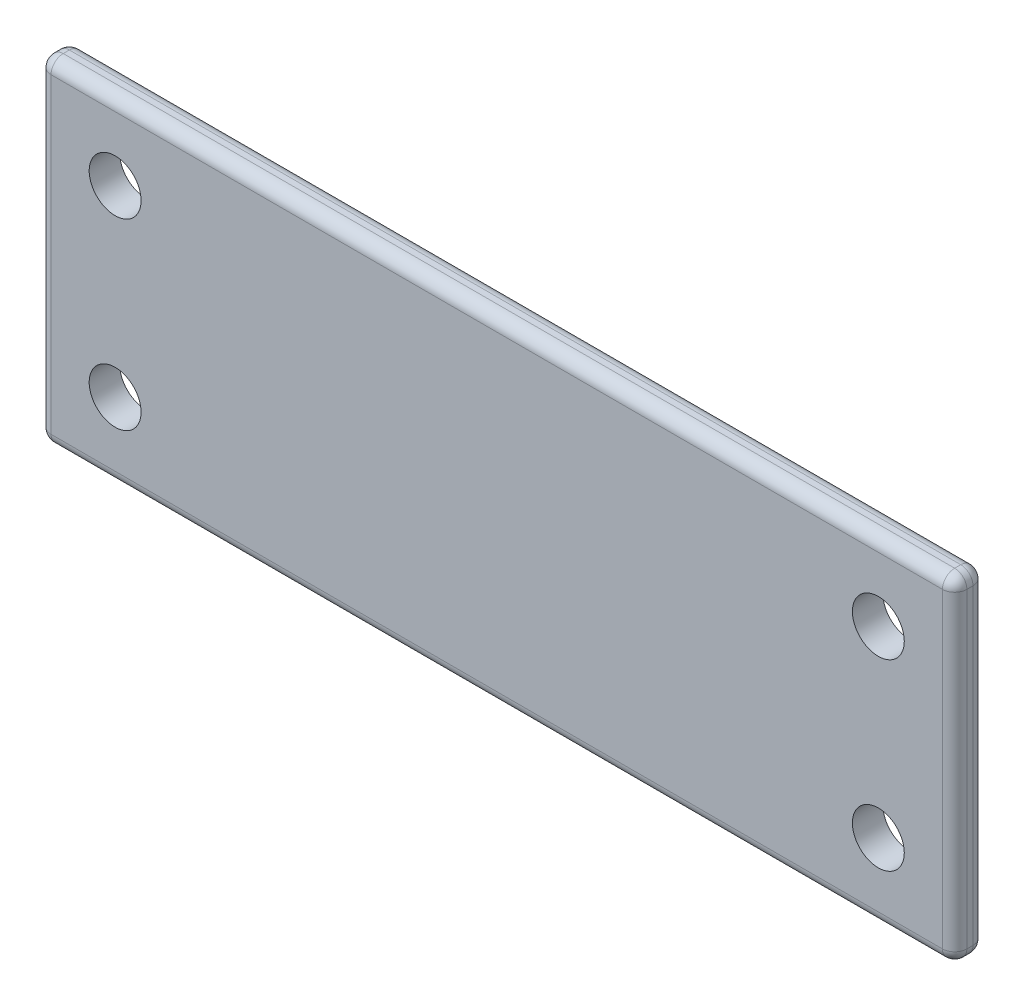
ISO-10303-21;
HEADER;
FILE_DESCRIPTION(('STEP AP214'),'2;1');
FILE_NAME('part.step','',(''),(''),'','','');
FILE_SCHEMA(('AUTOMOTIVE_DESIGN { 1 0 10303 214 1 1 1 1 }'));
ENDSEC;
DATA;
#1=APPLICATION_CONTEXT('core data for automotive mechanical design processes');
#2=APPLICATION_PROTOCOL_DEFINITION('international standard','automotive_design',2000,#1);
#3=PRODUCT_CONTEXT('',#1,'mechanical');
#4=PRODUCT('Part','Part','',(#3));
#5=PRODUCT_RELATED_PRODUCT_CATEGORY('part','',(#4));
#6=PRODUCT_DEFINITION_FORMATION('','',#4);
#7=PRODUCT_DEFINITION_CONTEXT('part definition',#1,'design');
#8=PRODUCT_DEFINITION('design','',#6,#7);
#9=PRODUCT_DEFINITION_SHAPE('','',#8);
#10=(LENGTH_UNIT() NAMED_UNIT(*) SI_UNIT(.MILLI.,.METRE.));
#11=(NAMED_UNIT(*) PLANE_ANGLE_UNIT() SI_UNIT($,.RADIAN.));
#12=(NAMED_UNIT(*) SI_UNIT($,.STERADIAN.) SOLID_ANGLE_UNIT());
#13=UNCERTAINTY_MEASURE_WITH_UNIT(LENGTH_MEASURE(1.E-05),#10,'distance_accuracy_value','');
#14=(GEOMETRIC_REPRESENTATION_CONTEXT(3) GLOBAL_UNCERTAINTY_ASSIGNED_CONTEXT((#13)) GLOBAL_UNIT_ASSIGNED_CONTEXT((#10,
#11,#12)) REPRESENTATION_CONTEXT('',''));
#15=CARTESIAN_POINT('',(0.,0.,0.));
#16=DIRECTION('',(0.,0.,1.));
#17=DIRECTION('',(1.,0.,0.));
#18=AXIS2_PLACEMENT_3D('',#15,#16,#17);
#19=CARTESIAN_POINT('',(29.2,19.2,8.781854409));
#20=DIRECTION('',(0.,-1.,0.));
#21=DIRECTION('',(1.,0.,0.));
#22=AXIS2_PLACEMENT_3D('',#19,#20,#21);
#23=SPHERICAL_SURFACE('',#22,0.8);
#24=CARTESIAN_POINT('',(29.2,19.2,8.781854409));
#25=DIRECTION('',(0.,0.,-1.));
#26=DIRECTION('',(1.,0.,0.));
#27=AXIS2_PLACEMENT_3D('',#24,#25,#26);
#28=CIRCLE('',#27,0.8);
#29=CARTESIAN_POINT('',(29.2,20.,8.781854409));
#30=VERTEX_POINT('',#29);
#31=CARTESIAN_POINT('',(30.,19.2,8.781854409));
#32=VERTEX_POINT('',#31);
#33=EDGE_CURVE('E10',#30,#32,#28,.T.);
#34=ORIENTED_EDGE('',*,*,#33,.F.);
#35=CARTESIAN_POINT('',(29.2,19.2,8.781854409));
#36=DIRECTION('',(1.,0.,0.));
#37=DIRECTION('',(0.,0.,1.));
#38=AXIS2_PLACEMENT_3D('',#35,#36,#37);
#39=CIRCLE('',#38,0.8);
#40=CARTESIAN_POINT('',(29.2,19.2,9.581854409));
#41=VERTEX_POINT('',#40);
#42=EDGE_CURVE('E318',#30,#41,#39,.T.);
#43=ORIENTED_EDGE('',*,*,#42,.T.);
#44=CARTESIAN_POINT('',(29.2,19.2,8.781854409));
#45=DIRECTION('',(0.,-1.,0.));
#46=DIRECTION('',(1.,0.,0.));
#47=AXIS2_PLACEMENT_3D('',#44,#45,#46);
#48=CIRCLE('',#47,0.8);
#49=EDGE_CURVE('E323',#32,#41,#48,.T.);
#50=ORIENTED_EDGE('',*,*,#49,.F.);
#51=EDGE_LOOP('',(#34,#43,#50));
#52=FACE_BOUND('',#51,.T.);
#53=ADVANCED_FACE('F16',(#52),#23,.T.);
#54=CARTESIAN_POINT('',(29.2,19.2,8.381854409));
#55=DIRECTION('',(0.,0.,1.));
#56=DIRECTION('',(1.,0.,0.));
#57=AXIS2_PLACEMENT_3D('',#54,#55,#56);
#58=SPHERICAL_SURFACE('',#57,0.8);
#59=CARTESIAN_POINT('',(29.2,19.2,8.381854409));
#60=DIRECTION('',(0.,-1.,0.));
#61=DIRECTION('',(1.,0.,0.));
#62=AXIS2_PLACEMENT_3D('',#59,#60,#61);
#63=CIRCLE('',#62,0.8);
#64=CARTESIAN_POINT('',(29.2,19.2,7.581854409));
#65=VERTEX_POINT('',#64);
#66=CARTESIAN_POINT('',(30.,19.2,8.381854409));
#67=VERTEX_POINT('',#66);
#68=EDGE_CURVE('E310',#65,#67,#63,.T.);
#69=ORIENTED_EDGE('',*,*,#68,.F.);
#70=CARTESIAN_POINT('',(29.2,19.2,8.381854409));
#71=DIRECTION('',(1.,0.,0.));
#72=DIRECTION('',(0.,1.,0.));
#73=AXIS2_PLACEMENT_3D('',#70,#71,#72);
#74=CIRCLE('',#73,0.8);
#75=CARTESIAN_POINT('',(29.2,20.,8.381854409));
#76=VERTEX_POINT('',#75);
#77=EDGE_CURVE('E303',#65,#76,#74,.T.);
#78=ORIENTED_EDGE('',*,*,#77,.T.);
#79=CARTESIAN_POINT('',(29.2,19.2,8.381854409));
#80=DIRECTION('',(0.,0.,1.));
#81=DIRECTION('',(1.,0.,0.));
#82=AXIS2_PLACEMENT_3D('',#79,#80,#81);
#83=CIRCLE('',#82,0.8);
#84=EDGE_CURVE('E19',#67,#76,#83,.T.);
#85=ORIENTED_EDGE('',*,*,#84,.F.);
#86=EDGE_LOOP('',(#69,#78,#85));
#87=FACE_BOUND('',#86,.T.);
#88=ADVANCED_FACE('F341',(#87),#58,.T.);
#89=CARTESIAN_POINT('',(30.,-2.,7.581854409));
#90=DIRECTION('',(1.,0.,0.));
#91=DIRECTION('',(0.,1.,0.));
#92=AXIS2_PLACEMENT_3D('',#89,#90,#91);
#93=PLANE('',#92);
#94=DIRECTION('',(0.,0.,1.));
#95=VECTOR('',#94,1.);
#96=CARTESIAN_POINT('',(30.,-1.2,7.581854409));
#97=LINE('',#96,#95);
#98=CARTESIAN_POINT('',(30.,-1.2,8.381854409));
#99=VERTEX_POINT('',#98);
#100=CARTESIAN_POINT('',(30.,-1.2,8.781854409));
#101=VERTEX_POINT('',#100);
#102=EDGE_CURVE('E299',#99,#101,#97,.T.);
#103=ORIENTED_EDGE('',*,*,#102,.F.);
#104=DIRECTION('',(0.,1.,0.));
#105=VECTOR('',#104,1.);
#106=CARTESIAN_POINT('',(30.,-2.,8.381854409));
#107=LINE('',#106,#105);
#108=EDGE_CURVE('E314',#99,#67,#107,.T.);
#109=ORIENTED_EDGE('',*,*,#108,.T.);
#110=DIRECTION('',(0.,0.,1.));
#111=VECTOR('',#110,1.);
#112=CARTESIAN_POINT('',(30.,19.2,7.581854409));
#113=LINE('',#112,#111);
#114=EDGE_CURVE('E328',#67,#32,#113,.T.);
#115=ORIENTED_EDGE('',*,*,#114,.T.);
#116=DIRECTION('',(0.,1.,0.));
#117=VECTOR('',#116,1.);
#118=CARTESIAN_POINT('',(30.,-2.,8.781854409));
#119=LINE('',#118,#117);
#120=EDGE_CURVE('E319',#101,#32,#119,.T.);
#121=ORIENTED_EDGE('',*,*,#120,.F.);
#122=EDGE_LOOP('',(#103,#109,#115,#121));
#123=FACE_BOUND('',#122,.T.);
#124=ADVANCED_FACE('F424',(#123),#93,.T.);
#125=CARTESIAN_POINT('',(29.2,-1.2,8.781854409));
#126=DIRECTION('',(0.,0.,-1.));
#127=DIRECTION('',(1.,0.,0.));
#128=AXIS2_PLACEMENT_3D('',#125,#126,#127);
#129=SPHERICAL_SURFACE('',#128,0.8);
#130=CARTESIAN_POINT('',(29.2,-1.2,8.781854409));
#131=DIRECTION('',(0.,1.,0.));
#132=DIRECTION('',(1.,0.,0.));
#133=AXIS2_PLACEMENT_3D('',#130,#131,#132);
#134=CIRCLE('',#133,0.8);
#135=CARTESIAN_POINT('',(29.2,-1.2,9.581854409));
#136=VERTEX_POINT('',#135);
#137=EDGE_CURVE('E326',#136,#101,#134,.T.);
#138=ORIENTED_EDGE('',*,*,#137,.F.);
#139=CARTESIAN_POINT('',(29.2,-1.2,8.781854409));
#140=DIRECTION('',(1.,0.,0.));
#141=DIRECTION('',(0.,-1.,0.));
#142=AXIS2_PLACEMENT_3D('',#139,#140,#141);
#143=CIRCLE('',#142,0.8);
#144=CARTESIAN_POINT('',(29.2,-2.,8.781854409));
#145=VERTEX_POINT('',#144);
#146=EDGE_CURVE('E291',#136,#145,#143,.T.);
#147=ORIENTED_EDGE('',*,*,#146,.T.);
#148=CARTESIAN_POINT('',(29.2,-1.2,8.781854409));
#149=DIRECTION('',(0.,0.,-1.));
#150=DIRECTION('',(1.,0.,0.));
#151=AXIS2_PLACEMENT_3D('',#148,#149,#150);
#152=CIRCLE('',#151,0.8);
#153=EDGE_CURVE('E295',#101,#145,#152,.T.);
#154=ORIENTED_EDGE('',*,*,#153,.F.);
#155=EDGE_LOOP('',(#138,#147,#154));
#156=FACE_BOUND('',#155,.T.);
#157=ADVANCED_FACE('F429',(#156),#129,.T.);
#158=CARTESIAN_POINT('',(29.2,-1.2,8.381854409));
#159=DIRECTION('',(0.,0.,1.));
#160=DIRECTION('',(1.,0.,0.));
#161=AXIS2_PLACEMENT_3D('',#158,#159,#160);
#162=SPHERICAL_SURFACE('',#161,0.8);
#163=CARTESIAN_POINT('',(29.2,-1.2,8.381854409));
#164=DIRECTION('',(0.,0.,-1.));
#165=DIRECTION('',(1.,0.,0.));
#166=AXIS2_PLACEMENT_3D('',#163,#164,#165);
#167=CIRCLE('',#166,0.8);
#168=CARTESIAN_POINT('',(29.2,-2.,8.381854409));
#169=VERTEX_POINT('',#168);
#170=EDGE_CURVE('E296',#99,#169,#167,.T.);
#171=ORIENTED_EDGE('',*,*,#170,.T.);
#172=CARTESIAN_POINT('',(29.2,-1.2,8.381854409));
#173=DIRECTION('',(-1.,0.,0.));
#174=DIRECTION('',(0.,-1.,0.));
#175=AXIS2_PLACEMENT_3D('',#172,#173,#174);
#176=CIRCLE('',#175,0.8);
#177=CARTESIAN_POINT('',(29.2,-1.2,7.581854409));
#178=VERTEX_POINT('',#177);
#179=EDGE_CURVE('E193',#178,#169,#176,.T.);
#180=ORIENTED_EDGE('',*,*,#179,.F.);
#181=CARTESIAN_POINT('',(29.2,-1.2,8.381854409));
#182=DIRECTION('',(0.,-1.,0.));
#183=DIRECTION('',(1.,0.,0.));
#184=AXIS2_PLACEMENT_3D('',#181,#182,#183);
#185=CIRCLE('',#184,0.8);
#186=EDGE_CURVE('E306',#178,#99,#185,.T.);
#187=ORIENTED_EDGE('',*,*,#186,.T.);
#188=EDGE_LOOP('',(#171,#180,#187));
#189=FACE_BOUND('',#188,.T.);
#190=ADVANCED_FACE('F449',(#189),#162,.T.);
#191=CARTESIAN_POINT('',(29.2,19.2,7.581854409));
#192=DIRECTION('',(0.,0.,1.));
#193=DIRECTION('',(1.,0.,0.));
#194=AXIS2_PLACEMENT_3D('',#191,#192,#193);
#195=CYLINDRICAL_SURFACE('',#194,0.8);
#196=ORIENTED_EDGE('',*,*,#114,.F.);
#197=ORIENTED_EDGE('',*,*,#84,.T.);
#198=DIRECTION('',(0.,0.,1.));
#199=VECTOR('',#198,1.);
#200=CARTESIAN_POINT('',(29.2,20.,7.581854409));
#201=LINE('',#200,#199);
#202=EDGE_CURVE('E194',#76,#30,#201,.T.);
#203=ORIENTED_EDGE('',*,*,#202,.T.);
#204=ORIENTED_EDGE('',*,*,#33,.T.);
#205=EDGE_LOOP('',(#196,#197,#203,#204));
#206=FACE_BOUND('',#205,.T.);
#207=ADVANCED_FACE('F338',(#206),#195,.T.);
#208=CARTESIAN_POINT('',(29.2,-2.,8.781854409));
#209=DIRECTION('',(0.,1.,0.));
#210=DIRECTION('',(1.,0.,0.));
#211=AXIS2_PLACEMENT_3D('',#208,#209,#210);
#212=CYLINDRICAL_SURFACE('',#211,0.8);
#213=ORIENTED_EDGE('',*,*,#120,.T.);
#214=ORIENTED_EDGE('',*,*,#49,.T.);
#215=DIRECTION('',(0.,1.,0.));
#216=VECTOR('',#215,1.);
#217=CARTESIAN_POINT('',(29.2,-2.,9.581854409));
#218=LINE('',#217,#216);
#219=EDGE_CURVE('E259',#136,#41,#218,.T.);
#220=ORIENTED_EDGE('',*,*,#219,.F.);
#221=ORIENTED_EDGE('',*,*,#137,.T.);
#222=EDGE_LOOP('',(#213,#214,#220,#221));
#223=FACE_BOUND('',#222,.T.);
#224=ADVANCED_FACE('F371',(#223),#212,.T.);
#225=CARTESIAN_POINT('',(-30.,19.2,8.781854409));
#226=DIRECTION('',(1.,0.,0.));
#227=DIRECTION('',(0.,1.,0.));
#228=AXIS2_PLACEMENT_3D('',#225,#226,#227);
#229=CYLINDRICAL_SURFACE('',#228,0.8);
#230=CARTESIAN_POINT('',(-29.2,19.2,8.781854409));
#231=DIRECTION('',(1.,0.,0.));
#232=DIRECTION('',(0.,0.,1.));
#233=AXIS2_PLACEMENT_3D('',#230,#231,#232);
#234=CIRCLE('',#233,0.8);
#235=CARTESIAN_POINT('',(-29.2,20.,8.781854409));
#236=VERTEX_POINT('',#235);
#237=CARTESIAN_POINT('',(-29.2,19.2,9.581854409));
#238=VERTEX_POINT('',#237);
#239=EDGE_CURVE('E283',#236,#238,#234,.T.);
#240=ORIENTED_EDGE('',*,*,#239,.T.);
#241=DIRECTION('',(1.,0.,0.));
#242=VECTOR('',#241,1.);
#243=CARTESIAN_POINT('',(-30.,19.2,9.581854409));
#244=LINE('',#243,#242);
#245=EDGE_CURVE('E263',#238,#41,#244,.T.);
#246=ORIENTED_EDGE('',*,*,#245,.T.);
#247=ORIENTED_EDGE('',*,*,#42,.F.);
#248=DIRECTION('',(1.,0.,0.));
#249=VECTOR('',#248,1.);
#250=CARTESIAN_POINT('',(-30.,20.,8.781854409));
#251=LINE('',#250,#249);
#252=EDGE_CURVE('E220',#236,#30,#251,.T.);
#253=ORIENTED_EDGE('',*,*,#252,.F.);
#254=EDGE_LOOP('',(#240,#246,#247,#253));
#255=FACE_BOUND('',#254,.T.);
#256=ADVANCED_FACE('F352',(#255),#229,.T.);
#257=CARTESIAN_POINT('',(25.,15.,6.081854409));
#258=DIRECTION('',(0.,0.,1.));
#259=DIRECTION('',(1.,0.,0.));
#260=AXIS2_PLACEMENT_3D('',#257,#258,#259);
#261=CYLINDRICAL_SURFACE('',#260,1.7);
#262=CARTESIAN_POINT('',(25.,15.,9.581854409));
#263=DIRECTION('',(0.,0.,1.));
#264=DIRECTION('',(1.,0.,0.));
#265=AXIS2_PLACEMENT_3D('',#262,#263,#264);
#266=CIRCLE('',#265,1.7);
#267=CARTESIAN_POINT('',(26.7,15.,9.581854409));
#268=VERTEX_POINT('',#267);
#269=EDGE_CURVE('E279',#268,#268,#266,.T.);
#270=ORIENTED_EDGE('',*,*,#269,.T.);
#271=EDGE_LOOP('',(#270));
#272=FACE_BOUND('',#271,.T.);
#273=CARTESIAN_POINT('',(25.,15.,7.581854409));
#274=DIRECTION('',(0.,0.,1.));
#275=DIRECTION('',(1.,0.,0.));
#276=AXIS2_PLACEMENT_3D('',#273,#274,#275);
#277=CIRCLE('',#276,1.7);
#278=CARTESIAN_POINT('',(26.7,15.,7.581854409));
#279=VERTEX_POINT('',#278);
#280=EDGE_CURVE('E247',#279,#279,#277,.T.);
#281=ORIENTED_EDGE('',*,*,#280,.F.);
#282=EDGE_LOOP('',(#281));
#283=FACE_BOUND('',#282,.T.);
#284=ADVANCED_FACE('F439',(#272,#283),#261,.F.);
#285=CARTESIAN_POINT('',(-25.,15.,6.081854409));
#286=DIRECTION('',(0.,0.,1.));
#287=DIRECTION('',(1.,0.,0.));
#288=AXIS2_PLACEMENT_3D('',#285,#286,#287);
#289=CYLINDRICAL_SURFACE('',#288,1.7);
#290=CARTESIAN_POINT('',(-25.,15.,9.581854409));
#291=DIRECTION('',(0.,0.,1.));
#292=DIRECTION('',(1.,0.,0.));
#293=AXIS2_PLACEMENT_3D('',#290,#291,#292);
#294=CIRCLE('',#293,1.7);
#295=CARTESIAN_POINT('',(-23.3,15.,9.581854409));
#296=VERTEX_POINT('',#295);
#297=EDGE_CURVE('E274',#296,#296,#294,.T.);
#298=ORIENTED_EDGE('',*,*,#297,.T.);
#299=EDGE_LOOP('',(#298));
#300=FACE_BOUND('',#299,.T.);
#301=CARTESIAN_POINT('',(-25.,15.,7.581854409));
#302=DIRECTION('',(0.,0.,1.));
#303=DIRECTION('',(1.,0.,0.));
#304=AXIS2_PLACEMENT_3D('',#301,#302,#303);
#305=CIRCLE('',#304,1.7);
#306=CARTESIAN_POINT('',(-23.3,15.,7.581854409));
#307=VERTEX_POINT('',#306);
#308=EDGE_CURVE('E243',#307,#307,#305,.T.);
#309=ORIENTED_EDGE('',*,*,#308,.F.);
#310=EDGE_LOOP('',(#309));
#311=FACE_BOUND('',#310,.T.);
#312=ADVANCED_FACE('F437',(#300,#311),#289,.F.);
#313=CARTESIAN_POINT('',(25.,3.,6.081854409));
#314=DIRECTION('',(0.,0.,1.));
#315=DIRECTION('',(1.,0.,0.));
#316=AXIS2_PLACEMENT_3D('',#313,#314,#315);
#317=CYLINDRICAL_SURFACE('',#316,1.7);
#318=CARTESIAN_POINT('',(25.,3.,9.581854409));
#319=DIRECTION('',(0.,0.,1.));
#320=DIRECTION('',(1.,0.,0.));
#321=AXIS2_PLACEMENT_3D('',#318,#319,#320);
#322=CIRCLE('',#321,1.7);
#323=CARTESIAN_POINT('',(26.7,3.,9.581854409));
#324=VERTEX_POINT('',#323);
#325=EDGE_CURVE('E271',#324,#324,#322,.T.);
#326=ORIENTED_EDGE('',*,*,#325,.T.);
#327=EDGE_LOOP('',(#326));
#328=FACE_BOUND('',#327,.T.);
#329=CARTESIAN_POINT('',(25.,3.,7.581854409));
#330=DIRECTION('',(0.,0.,1.));
#331=DIRECTION('',(1.,0.,0.));
#332=AXIS2_PLACEMENT_3D('',#329,#330,#331);
#333=CIRCLE('',#332,1.7);
#334=CARTESIAN_POINT('',(26.7,3.,7.581854409));
#335=VERTEX_POINT('',#334);
#336=EDGE_CURVE('E239',#335,#335,#333,.T.);
#337=ORIENTED_EDGE('',*,*,#336,.F.);
#338=EDGE_LOOP('',(#337));
#339=FACE_BOUND('',#338,.T.);
#340=ADVANCED_FACE('F434',(#328,#339),#317,.F.);
#341=CARTESIAN_POINT('',(-25.,3.,6.081854409));
#342=DIRECTION('',(0.,0.,1.));
#343=DIRECTION('',(1.,0.,0.));
#344=AXIS2_PLACEMENT_3D('',#341,#342,#343);
#345=CYLINDRICAL_SURFACE('',#344,1.7);
#346=CARTESIAN_POINT('',(-25.,3.,9.581854409));
#347=DIRECTION('',(0.,0.,1.));
#348=DIRECTION('',(1.,0.,0.));
#349=AXIS2_PLACEMENT_3D('',#346,#347,#348);
#350=CIRCLE('',#349,1.7);
#351=CARTESIAN_POINT('',(-23.3,3.,9.581854409));
#352=VERTEX_POINT('',#351);
#353=EDGE_CURVE('E267',#352,#352,#350,.T.);
#354=ORIENTED_EDGE('',*,*,#353,.T.);
#355=EDGE_LOOP('',(#354));
#356=FACE_BOUND('',#355,.T.);
#357=CARTESIAN_POINT('',(-25.,3.,7.581854409));
#358=DIRECTION('',(0.,0.,1.));
#359=DIRECTION('',(1.,0.,0.));
#360=AXIS2_PLACEMENT_3D('',#357,#358,#359);
#361=CIRCLE('',#360,1.7);
#362=CARTESIAN_POINT('',(-23.3,3.,7.581854409));
#363=VERTEX_POINT('',#362);
#364=EDGE_CURVE('E146',#363,#363,#361,.T.);
#365=ORIENTED_EDGE('',*,*,#364,.F.);
#366=EDGE_LOOP('',(#365));
#367=FACE_BOUND('',#366,.T.);
#368=ADVANCED_FACE('F432',(#356,#367),#345,.F.);
#369=CARTESIAN_POINT('',(29.2,-2.,8.381854409));
#370=DIRECTION('',(0.,1.,0.));
#371=DIRECTION('',(1.,0.,0.));
#372=AXIS2_PLACEMENT_3D('',#369,#370,#371);
#373=CYLINDRICAL_SURFACE('',#372,0.8);
#374=ORIENTED_EDGE('',*,*,#186,.F.);
#375=DIRECTION('',(0.,1.,0.));
#376=VECTOR('',#375,1.);
#377=CARTESIAN_POINT('',(29.2,-2.,7.581854409));
#378=LINE('',#377,#376);
#379=EDGE_CURVE('E142',#178,#65,#378,.T.);
#380=ORIENTED_EDGE('',*,*,#379,.T.);
#381=ORIENTED_EDGE('',*,*,#68,.T.);
#382=ORIENTED_EDGE('',*,*,#108,.F.);
#383=EDGE_LOOP('',(#374,#380,#381,#382));
#384=FACE_BOUND('',#383,.T.);
#385=ADVANCED_FACE('F469',(#384),#373,.T.);
#386=CARTESIAN_POINT('',(-30.,19.2,8.381854409));
#387=DIRECTION('',(1.,0.,0.));
#388=DIRECTION('',(0.,1.,0.));
#389=AXIS2_PLACEMENT_3D('',#386,#387,#388);
#390=CYLINDRICAL_SURFACE('',#389,0.8);
#391=DIRECTION('',(1.,0.,0.));
#392=VECTOR('',#391,1.);
#393=CARTESIAN_POINT('',(-30.,20.,8.381854409));
#394=LINE('',#393,#392);
#395=CARTESIAN_POINT('',(-29.2,20.,8.381854409));
#396=VERTEX_POINT('',#395);
#397=EDGE_CURVE('E189',#396,#76,#394,.T.);
#398=ORIENTED_EDGE('',*,*,#397,.T.);
#399=ORIENTED_EDGE('',*,*,#77,.F.);
#400=DIRECTION('',(1.,0.,0.));
#401=VECTOR('',#400,1.);
#402=CARTESIAN_POINT('',(-30.,19.2,7.581854409));
#403=LINE('',#402,#401);
#404=CARTESIAN_POINT('',(-29.2,19.2,7.581854409));
#405=VERTEX_POINT('',#404);
#406=EDGE_CURVE('E231',#405,#65,#403,.T.);
#407=ORIENTED_EDGE('',*,*,#406,.F.);
#408=CARTESIAN_POINT('',(-29.2,19.2,8.381854409));
#409=DIRECTION('',(1.,0.,0.));
#410=DIRECTION('',(0.,1.,0.));
#411=AXIS2_PLACEMENT_3D('',#408,#409,#410);
#412=CIRCLE('',#411,0.8);
#413=EDGE_CURVE('E251',#405,#396,#412,.T.);
#414=ORIENTED_EDGE('',*,*,#413,.T.);
#415=EDGE_LOOP('',(#398,#399,#407,#414));
#416=FACE_BOUND('',#415,.T.);
#417=ADVANCED_FACE('F344',(#416),#390,.T.);
#418=CARTESIAN_POINT('',(29.2,-1.2,7.581854409));
#419=DIRECTION('',(0.,0.,1.));
#420=DIRECTION('',(1.,0.,0.));
#421=AXIS2_PLACEMENT_3D('',#418,#419,#420);
#422=CYLINDRICAL_SURFACE('',#421,0.8);
#423=ORIENTED_EDGE('',*,*,#153,.T.);
#424=DIRECTION('',(0.,0.,1.));
#425=VECTOR('',#424,1.);
#426=CARTESIAN_POINT('',(29.2,-2.,7.581854409));
#427=LINE('',#426,#425);
#428=EDGE_CURVE('E223',#169,#145,#427,.T.);
#429=ORIENTED_EDGE('',*,*,#428,.F.);
#430=ORIENTED_EDGE('',*,*,#170,.F.);
#431=ORIENTED_EDGE('',*,*,#102,.T.);
#432=EDGE_LOOP('',(#423,#429,#430,#431));
#433=FACE_BOUND('',#432,.T.);
#434=ADVANCED_FACE('F466',(#433),#422,.T.);
#435=CARTESIAN_POINT('',(-30.,-1.2,8.781854409));
#436=DIRECTION('',(1.,0.,0.));
#437=DIRECTION('',(0.,-1.,0.));
#438=AXIS2_PLACEMENT_3D('',#435,#436,#437);
#439=CYLINDRICAL_SURFACE('',#438,0.8);
#440=DIRECTION('',(1.,0.,0.));
#441=VECTOR('',#440,1.);
#442=CARTESIAN_POINT('',(-30.,-2.,8.781854409));
#443=LINE('',#442,#441);
#444=CARTESIAN_POINT('',(-29.2,-2.,8.781854409));
#445=VERTEX_POINT('',#444);
#446=EDGE_CURVE('E227',#445,#145,#443,.T.);
#447=ORIENTED_EDGE('',*,*,#446,.T.);
#448=ORIENTED_EDGE('',*,*,#146,.F.);
#449=DIRECTION('',(1.,0.,0.));
#450=VECTOR('',#449,1.);
#451=CARTESIAN_POINT('',(-30.,-1.2,9.581854409));
#452=LINE('',#451,#450);
#453=CARTESIAN_POINT('',(-29.2,-1.2,9.581854409));
#454=VERTEX_POINT('',#453);
#455=EDGE_CURVE('E255',#454,#136,#452,.T.);
#456=ORIENTED_EDGE('',*,*,#455,.F.);
#457=CARTESIAN_POINT('',(-29.2,-1.2,8.781854409));
#458=DIRECTION('',(1.,0.,0.));
#459=DIRECTION('',(0.,-1.,0.));
#460=AXIS2_PLACEMENT_3D('',#457,#458,#459);
#461=CIRCLE('',#460,0.8);
#462=EDGE_CURVE('E158',#454,#445,#461,.T.);
#463=ORIENTED_EDGE('',*,*,#462,.T.);
#464=EDGE_LOOP('',(#447,#448,#456,#463));
#465=FACE_BOUND('',#464,.T.);
#466=ADVANCED_FACE('F460',(#465),#439,.T.);
#467=CARTESIAN_POINT('',(-30.,-1.2,8.381854409));
#468=DIRECTION('',(1.,0.,0.));
#469=DIRECTION('',(0.,-1.,0.));
#470=AXIS2_PLACEMENT_3D('',#467,#468,#469);
#471=CYLINDRICAL_SURFACE('',#470,0.8);
#472=CARTESIAN_POINT('',(-29.2,-1.2,8.381854409));
#473=DIRECTION('',(-1.,0.,0.));
#474=DIRECTION('',(0.,-1.,0.));
#475=AXIS2_PLACEMENT_3D('',#472,#473,#474);
#476=CIRCLE('',#475,0.8);
#477=CARTESIAN_POINT('',(-29.2,-1.2,7.581854409));
#478=VERTEX_POINT('',#477);
#479=CARTESIAN_POINT('',(-29.2,-2.,8.381854409));
#480=VERTEX_POINT('',#479);
#481=EDGE_CURVE('E149',#478,#480,#476,.T.);
#482=ORIENTED_EDGE('',*,*,#481,.F.);
#483=DIRECTION('',(1.,0.,0.));
#484=VECTOR('',#483,1.);
#485=CARTESIAN_POINT('',(-30.,-1.2,7.581854409));
#486=LINE('',#485,#484);
#487=EDGE_CURVE('E134',#478,#178,#486,.T.);
#488=ORIENTED_EDGE('',*,*,#487,.T.);
#489=ORIENTED_EDGE('',*,*,#179,.T.);
#490=DIRECTION('',(1.,0.,0.));
#491=VECTOR('',#490,1.);
#492=CARTESIAN_POINT('',(-30.,-2.,8.381854409));
#493=LINE('',#492,#491);
#494=EDGE_CURVE('E153',#480,#169,#493,.T.);
#495=ORIENTED_EDGE('',*,*,#494,.F.);
#496=EDGE_LOOP('',(#482,#488,#489,#495));
#497=FACE_BOUND('',#496,.T.);
#498=ADVANCED_FACE('F151',(#497),#471,.T.);
#499=CARTESIAN_POINT('',(-30.,20.,7.581854409));
#500=DIRECTION('',(0.,1.,0.));
#501=DIRECTION('',(1.,0.,0.));
#502=AXIS2_PLACEMENT_3D('',#499,#500,#501);
#503=PLANE('',#502);
#504=DIRECTION('',(0.,0.,1.));
#505=VECTOR('',#504,1.);
#506=CARTESIAN_POINT('',(-29.2,20.,7.581854409));
#507=LINE('',#506,#505);
#508=EDGE_CURVE('E204',#396,#236,#507,.T.);
#509=ORIENTED_EDGE('',*,*,#508,.T.);
#510=ORIENTED_EDGE('',*,*,#252,.T.);
#511=ORIENTED_EDGE('',*,*,#202,.F.);
#512=ORIENTED_EDGE('',*,*,#397,.F.);
#513=EDGE_LOOP('',(#509,#510,#511,#512));
#514=FACE_BOUND('',#513,.T.);
#515=ADVANCED_FACE('F346',(#514),#503,.T.);
#516=CARTESIAN_POINT('',(-29.2,19.2,8.781854409));
#517=DIRECTION('',(0.,-1.,0.));
#518=DIRECTION('',(-1.,0.,0.));
#519=AXIS2_PLACEMENT_3D('',#516,#517,#518);
#520=SPHERICAL_SURFACE('',#519,0.8);
#521=CARTESIAN_POINT('',(-29.2,19.2,8.781854409));
#522=DIRECTION('',(0.,1.,0.));
#523=DIRECTION('',(-1.,0.,0.));
#524=AXIS2_PLACEMENT_3D('',#521,#522,#523);
#525=CIRCLE('',#524,0.8);
#526=CARTESIAN_POINT('',(-30.,19.2,8.781854409));
#527=VERTEX_POINT('',#526);
#528=EDGE_CURVE('E211',#527,#238,#525,.T.);
#529=ORIENTED_EDGE('',*,*,#528,.T.);
#530=ORIENTED_EDGE('',*,*,#239,.F.);
#531=CARTESIAN_POINT('',(-29.2,19.2,8.781854409));
#532=DIRECTION('',(0.,0.,1.));
#533=DIRECTION('',(-1.,0.,0.));
#534=AXIS2_PLACEMENT_3D('',#531,#532,#533);
#535=CIRCLE('',#534,0.8);
#536=EDGE_CURVE('E212',#236,#527,#535,.T.);
#537=ORIENTED_EDGE('',*,*,#536,.T.);
#538=EDGE_LOOP('',(#529,#530,#537));
#539=FACE_BOUND('',#538,.T.);
#540=ADVANCED_FACE('F357',(#539),#520,.T.);
#541=CARTESIAN_POINT('',(-30.,-2.,9.581854409));
#542=DIRECTION('',(0.,0.,1.));
#543=DIRECTION('',(1.,0.,0.));
#544=AXIS2_PLACEMENT_3D('',#541,#542,#543);
#545=PLANE('',#544);
#546=ORIENTED_EDGE('',*,*,#269,.F.);
#547=EDGE_LOOP('',(#546));
#548=FACE_BOUND('',#547,.T.);
#549=ORIENTED_EDGE('',*,*,#297,.F.);
#550=EDGE_LOOP('',(#549));
#551=FACE_BOUND('',#550,.T.);
#552=ORIENTED_EDGE('',*,*,#325,.F.);
#553=EDGE_LOOP('',(#552));
#554=FACE_BOUND('',#553,.T.);
#555=ORIENTED_EDGE('',*,*,#353,.F.);
#556=EDGE_LOOP('',(#555));
#557=FACE_BOUND('',#556,.T.);
#558=DIRECTION('',(0.,1.,0.));
#559=VECTOR('',#558,1.);
#560=CARTESIAN_POINT('',(-29.2,-2.,9.581854409));
#561=LINE('',#560,#559);
#562=EDGE_CURVE('E196',#454,#238,#561,.T.);
#563=ORIENTED_EDGE('',*,*,#562,.F.);
#564=ORIENTED_EDGE('',*,*,#455,.T.);
#565=ORIENTED_EDGE('',*,*,#219,.T.);
#566=ORIENTED_EDGE('',*,*,#245,.F.);
#567=EDGE_LOOP('',(#563,#564,#565,#566));
#568=FACE_BOUND('',#567,.T.);
#569=ADVANCED_FACE('F368',(#548,#551,#554,#557,#568),#545,.T.);
#570=CARTESIAN_POINT('',(-29.2,19.2,8.381854409));
#571=DIRECTION('',(0.,0.,1.));
#572=DIRECTION('',(-1.,0.,0.));
#573=AXIS2_PLACEMENT_3D('',#570,#571,#572);
#574=SPHERICAL_SURFACE('',#573,0.8);
#575=CARTESIAN_POINT('',(-29.2,19.2,8.381854409));
#576=DIRECTION('',(0.,0.,-1.));
#577=DIRECTION('',(-1.,0.,0.));
#578=AXIS2_PLACEMENT_3D('',#575,#576,#577);
#579=CIRCLE('',#578,0.8);
#580=CARTESIAN_POINT('',(-30.,19.2,8.381854409));
#581=VERTEX_POINT('',#580);
#582=EDGE_CURVE('E159',#581,#396,#579,.T.);
#583=ORIENTED_EDGE('',*,*,#582,.T.);
#584=ORIENTED_EDGE('',*,*,#413,.F.);
#585=CARTESIAN_POINT('',(-29.2,19.2,8.381854409));
#586=DIRECTION('',(0.,1.,0.));
#587=DIRECTION('',(-1.,0.,0.));
#588=AXIS2_PLACEMENT_3D('',#585,#586,#587);
#589=CIRCLE('',#588,0.8);
#590=EDGE_CURVE('E173',#405,#581,#589,.T.);
#591=ORIENTED_EDGE('',*,*,#590,.T.);
#592=EDGE_LOOP('',(#583,#584,#591));
#593=FACE_BOUND('',#592,.T.);
#594=ADVANCED_FACE('F406',(#593),#574,.T.);
#595=CARTESIAN_POINT('',(-30.,-2.,7.581854409));
#596=DIRECTION('',(0.,0.,1.));
#597=DIRECTION('',(1.,0.,0.));
#598=AXIS2_PLACEMENT_3D('',#595,#596,#597);
#599=PLANE('',#598);
#600=ORIENTED_EDGE('',*,*,#280,.T.);
#601=EDGE_LOOP('',(#600));
#602=FACE_BOUND('',#601,.T.);
#603=ORIENTED_EDGE('',*,*,#308,.T.);
#604=EDGE_LOOP('',(#603));
#605=FACE_BOUND('',#604,.T.);
#606=ORIENTED_EDGE('',*,*,#336,.T.);
#607=EDGE_LOOP('',(#606));
#608=FACE_BOUND('',#607,.T.);
#609=ORIENTED_EDGE('',*,*,#364,.T.);
#610=EDGE_LOOP('',(#609));
#611=FACE_BOUND('',#610,.T.);
#612=ORIENTED_EDGE('',*,*,#406,.T.);
#613=ORIENTED_EDGE('',*,*,#379,.F.);
#614=ORIENTED_EDGE('',*,*,#487,.F.);
#615=DIRECTION('',(0.,1.,0.));
#616=VECTOR('',#615,1.);
#617=CARTESIAN_POINT('',(-29.2,-2.,7.581854409));
#618=LINE('',#617,#616);
#619=EDGE_CURVE('E139',#478,#405,#618,.T.);
#620=ORIENTED_EDGE('',*,*,#619,.T.);
#621=EDGE_LOOP('',(#612,#613,#614,#620));
#622=FACE_BOUND('',#621,.T.);
#623=ADVANCED_FACE('F137',(#602,#605,#608,#611,#622),#599,.F.);
#624=CARTESIAN_POINT('',(-30.,-2.,7.581854409));
#625=DIRECTION('',(0.,1.,0.));
#626=DIRECTION('',(1.,0.,0.));
#627=AXIS2_PLACEMENT_3D('',#624,#625,#626);
#628=PLANE('',#627);
#629=ORIENTED_EDGE('',*,*,#494,.T.);
#630=ORIENTED_EDGE('',*,*,#428,.T.);
#631=ORIENTED_EDGE('',*,*,#446,.F.);
#632=DIRECTION('',(0.,0.,1.));
#633=VECTOR('',#632,1.);
#634=CARTESIAN_POINT('',(-29.2,-2.,7.581854409));
#635=LINE('',#634,#633);
#636=EDGE_CURVE('E185',#480,#445,#635,.T.);
#637=ORIENTED_EDGE('',*,*,#636,.F.);
#638=EDGE_LOOP('',(#629,#630,#631,#637));
#639=FACE_BOUND('',#638,.T.);
#640=ADVANCED_FACE('F414',(#639),#628,.F.);
#641=CARTESIAN_POINT('',(-29.2,-1.2,8.781854409));
#642=DIRECTION('',(0.,0.,-1.));
#643=DIRECTION('',(-1.,0.,0.));
#644=AXIS2_PLACEMENT_3D('',#641,#642,#643);
#645=SPHERICAL_SURFACE('',#644,0.8);
#646=CARTESIAN_POINT('',(-29.2,-1.2,8.781854409));
#647=DIRECTION('',(0.,0.,1.));
#648=DIRECTION('',(-1.,0.,0.));
#649=AXIS2_PLACEMENT_3D('',#646,#647,#648);
#650=CIRCLE('',#649,0.8);
#651=CARTESIAN_POINT('',(-30.,-1.2,8.781854409));
#652=VERTEX_POINT('',#651);
#653=EDGE_CURVE('E180',#652,#445,#650,.T.);
#654=ORIENTED_EDGE('',*,*,#653,.T.);
#655=ORIENTED_EDGE('',*,*,#462,.F.);
#656=CARTESIAN_POINT('',(-29.2,-1.2,8.781854409));
#657=DIRECTION('',(0.,-1.,0.));
#658=DIRECTION('',(-1.,0.,0.));
#659=AXIS2_PLACEMENT_3D('',#656,#657,#658);
#660=CIRCLE('',#659,0.8);
#661=EDGE_CURVE('E169',#454,#652,#660,.T.);
#662=ORIENTED_EDGE('',*,*,#661,.T.);
#663=EDGE_LOOP('',(#654,#655,#662));
#664=FACE_BOUND('',#663,.T.);
#665=ADVANCED_FACE('F483',(#664),#645,.T.);
#666=CARTESIAN_POINT('',(-29.2,-1.2,8.381854409));
#667=DIRECTION('',(0.,0.,1.));
#668=DIRECTION('',(-1.,0.,0.));
#669=AXIS2_PLACEMENT_3D('',#666,#667,#668);
#670=SPHERICAL_SURFACE('',#669,0.8);
#671=CARTESIAN_POINT('',(-29.2,-1.2,8.381854409));
#672=DIRECTION('',(0.,1.,0.));
#673=DIRECTION('',(-1.,0.,0.));
#674=AXIS2_PLACEMENT_3D('',#671,#672,#673);
#675=CIRCLE('',#674,0.8);
#676=CARTESIAN_POINT('',(-30.,-1.2,8.381854409));
#677=VERTEX_POINT('',#676);
#678=EDGE_CURVE('E161',#478,#677,#675,.T.);
#679=ORIENTED_EDGE('',*,*,#678,.F.);
#680=ORIENTED_EDGE('',*,*,#481,.T.);
#681=CARTESIAN_POINT('',(-29.2,-1.2,8.381854409));
#682=DIRECTION('',(0.,0.,1.));
#683=DIRECTION('',(-1.,0.,0.));
#684=AXIS2_PLACEMENT_3D('',#681,#682,#683);
#685=CIRCLE('',#684,0.8);
#686=EDGE_CURVE('E164',#677,#480,#685,.T.);
#687=ORIENTED_EDGE('',*,*,#686,.F.);
#688=EDGE_LOOP('',(#679,#680,#687));
#689=FACE_BOUND('',#688,.T.);
#690=ADVANCED_FACE('F162',(#689),#670,.T.);
#691=CARTESIAN_POINT('',(-29.2,19.2,7.581854409));
#692=DIRECTION('',(0.,0.,1.));
#693=DIRECTION('',(-1.,0.,0.));
#694=AXIS2_PLACEMENT_3D('',#691,#692,#693);
#695=CYLINDRICAL_SURFACE('',#694,0.8);
#696=ORIENTED_EDGE('',*,*,#536,.F.);
#697=ORIENTED_EDGE('',*,*,#508,.F.);
#698=ORIENTED_EDGE('',*,*,#582,.F.);
#699=DIRECTION('',(0.,0.,1.));
#700=VECTOR('',#699,1.);
#701=CARTESIAN_POINT('',(-30.,19.2,7.581854409));
#702=LINE('',#701,#700);
#703=EDGE_CURVE('E381',#581,#527,#702,.T.);
#704=ORIENTED_EDGE('',*,*,#703,.T.);
#705=EDGE_LOOP('',(#696,#697,#698,#704));
#706=FACE_BOUND('',#705,.T.);
#707=ADVANCED_FACE('F404',(#706),#695,.T.);
#708=CARTESIAN_POINT('',(-29.2,-2.,8.781854409));
#709=DIRECTION('',(0.,1.,0.));
#710=DIRECTION('',(-1.,0.,0.));
#711=AXIS2_PLACEMENT_3D('',#708,#709,#710);
#712=CYLINDRICAL_SURFACE('',#711,0.8);
#713=ORIENTED_EDGE('',*,*,#661,.F.);
#714=ORIENTED_EDGE('',*,*,#562,.T.);
#715=ORIENTED_EDGE('',*,*,#528,.F.);
#716=DIRECTION('',(0.,1.,0.));
#717=VECTOR('',#716,1.);
#718=CARTESIAN_POINT('',(-30.,-2.,8.781854409));
#719=LINE('',#718,#717);
#720=EDGE_CURVE('E384',#652,#527,#719,.T.);
#721=ORIENTED_EDGE('',*,*,#720,.F.);
#722=EDGE_LOOP('',(#713,#714,#715,#721));
#723=FACE_BOUND('',#722,.T.);
#724=ADVANCED_FACE('F366',(#723),#712,.T.);
#725=CARTESIAN_POINT('',(-29.2,-2.,8.381854409));
#726=DIRECTION('',(0.,1.,0.));
#727=DIRECTION('',(-1.,0.,0.));
#728=AXIS2_PLACEMENT_3D('',#725,#726,#727);
#729=CYLINDRICAL_SURFACE('',#728,0.8);
#730=DIRECTION('',(0.,1.,0.));
#731=VECTOR('',#730,1.);
#732=CARTESIAN_POINT('',(-30.,-2.,8.381854409));
#733=LINE('',#732,#731);
#734=EDGE_CURVE('E383',#677,#581,#733,.T.);
#735=ORIENTED_EDGE('',*,*,#734,.T.);
#736=ORIENTED_EDGE('',*,*,#590,.F.);
#737=ORIENTED_EDGE('',*,*,#619,.F.);
#738=ORIENTED_EDGE('',*,*,#678,.T.);
#739=EDGE_LOOP('',(#735,#736,#737,#738));
#740=FACE_BOUND('',#739,.T.);
#741=ADVANCED_FACE('F171',(#740),#729,.T.);
#742=CARTESIAN_POINT('',(-29.2,-1.2,7.581854409));
#743=DIRECTION('',(0.,0.,1.));
#744=DIRECTION('',(-1.,0.,0.));
#745=AXIS2_PLACEMENT_3D('',#742,#743,#744);
#746=CYLINDRICAL_SURFACE('',#745,0.8);
#747=DIRECTION('',(0.,0.,1.));
#748=VECTOR('',#747,1.);
#749=CARTESIAN_POINT('',(-30.,-1.2,7.581854409));
#750=LINE('',#749,#748);
#751=EDGE_CURVE('E386',#677,#652,#750,.T.);
#752=ORIENTED_EDGE('',*,*,#751,.F.);
#753=ORIENTED_EDGE('',*,*,#686,.T.);
#754=ORIENTED_EDGE('',*,*,#636,.T.);
#755=ORIENTED_EDGE('',*,*,#653,.F.);
#756=EDGE_LOOP('',(#752,#753,#754,#755));
#757=FACE_BOUND('',#756,.T.);
#758=ADVANCED_FACE('F504',(#757),#746,.T.);
#759=CARTESIAN_POINT('',(-30.,-2.,7.581854409));
#760=DIRECTION('',(1.,0.,0.));
#761=DIRECTION('',(0.,1.,0.));
#762=AXIS2_PLACEMENT_3D('',#759,#760,#761);
#763=PLANE('',#762);
#764=ORIENTED_EDGE('',*,*,#720,.T.);
#765=ORIENTED_EDGE('',*,*,#703,.F.);
#766=ORIENTED_EDGE('',*,*,#734,.F.);
#767=ORIENTED_EDGE('',*,*,#751,.T.);
#768=EDGE_LOOP('',(#764,#765,#766,#767));
#769=FACE_BOUND('',#768,.T.);
#770=ADVANCED_FACE('F402',(#769),#763,.F.);
#771=CLOSED_SHELL('',(#53,#88,#124,#157,#190,#207,#224,#256,#284,#312,#340,#368,#385,#417,#434,
#466,#498,#515,#540,#569,#594,#623,#640,#665,#690,#707,#724,#741,#758,#770));
#772=MANIFOLD_SOLID_BREP('B1',#771);
#773=ADVANCED_BREP_SHAPE_REPRESENTATION('',(#18,#772),#14);
#774=SHAPE_DEFINITION_REPRESENTATION(#9,#773);
ENDSEC;
END-ISO-10303-21;
